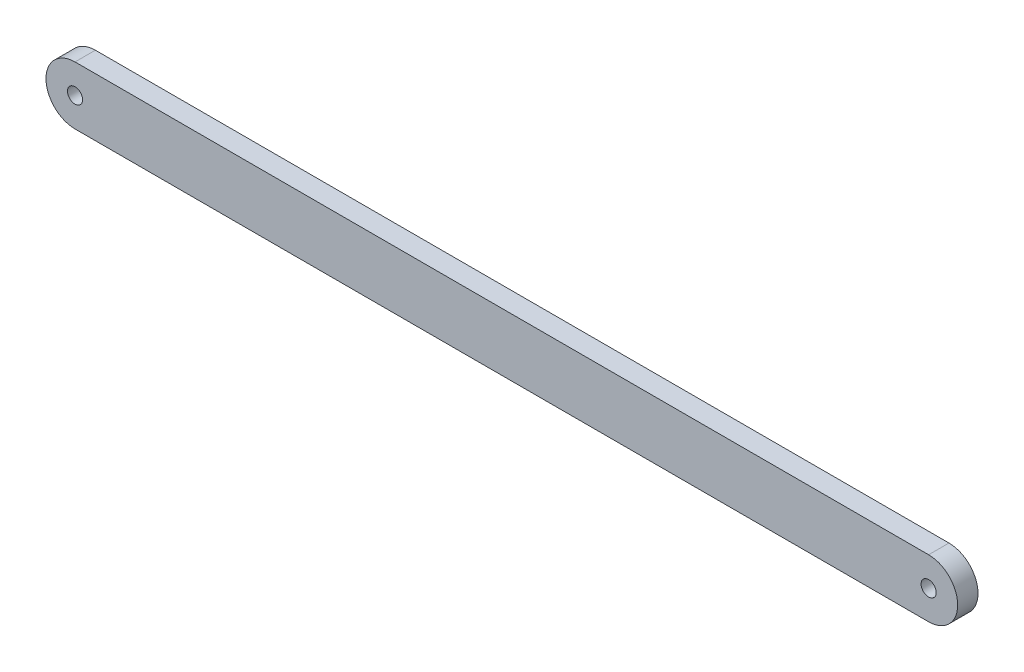
ISO-10303-21;
HEADER;
FILE_DESCRIPTION(('STEP AP214'),'2;1');
FILE_NAME('part.step','',(''),(''),'','','');
FILE_SCHEMA(('AUTOMOTIVE_DESIGN { 1 0 10303 214 1 1 1 1 }'));
ENDSEC;
DATA;
#1=APPLICATION_CONTEXT('core data for automotive mechanical design processes');
#2=APPLICATION_PROTOCOL_DEFINITION('international standard','automotive_design',2000,#1);
#3=PRODUCT_CONTEXT('',#1,'mechanical');
#4=PRODUCT('Part','Part','',(#3));
#5=PRODUCT_RELATED_PRODUCT_CATEGORY('part','',(#4));
#6=PRODUCT_DEFINITION_FORMATION('','',#4);
#7=PRODUCT_DEFINITION_CONTEXT('part definition',#1,'design');
#8=PRODUCT_DEFINITION('design','',#6,#7);
#9=PRODUCT_DEFINITION_SHAPE('','',#8);
#10=(LENGTH_UNIT() NAMED_UNIT(*) SI_UNIT(.MILLI.,.METRE.));
#11=(NAMED_UNIT(*) PLANE_ANGLE_UNIT() SI_UNIT($,.RADIAN.));
#12=(NAMED_UNIT(*) SI_UNIT($,.STERADIAN.) SOLID_ANGLE_UNIT());
#13=UNCERTAINTY_MEASURE_WITH_UNIT(LENGTH_MEASURE(1.E-05),#10,'distance_accuracy_value','');
#14=(GEOMETRIC_REPRESENTATION_CONTEXT(3) GLOBAL_UNCERTAINTY_ASSIGNED_CONTEXT((#13)) GLOBAL_UNIT_ASSIGNED_CONTEXT((#10,
#11,#12)) REPRESENTATION_CONTEXT('',''));
#15=CARTESIAN_POINT('',(0.,0.,0.));
#16=DIRECTION('',(0.,0.,1.));
#17=DIRECTION('',(1.,0.,0.));
#18=AXIS2_PLACEMENT_3D('',#15,#16,#17);
#19=CARTESIAN_POINT('',(0.,0.,7.));
#20=DIRECTION('',(0.,0.,1.));
#21=DIRECTION('',(1.,0.,0.));
#22=AXIS2_PLACEMENT_3D('',#19,#20,#21);
#23=PLANE('',#22);
#24=CARTESIAN_POINT('',(0.,0.,7.));
#25=DIRECTION('',(0.,0.,1.));
#26=DIRECTION('',(1.,0.,0.));
#27=AXIS2_PLACEMENT_3D('',#24,#25,#26);
#28=CIRCLE('',#27,2.6);
#29=CARTESIAN_POINT('',(2.6,0.,7.));
#30=VERTEX_POINT('',#29);
#31=EDGE_CURVE('E107',#30,#30,#28,.T.);
#32=ORIENTED_EDGE('',*,*,#31,.F.);
#33=EDGE_LOOP('',(#32));
#34=FACE_BOUND('',#33,.T.);
#35=CARTESIAN_POINT('',(0.,0.,7.));
#36=DIRECTION('',(0.,0.,1.));
#37=DIRECTION('',(1.,0.,0.));
#38=AXIS2_PLACEMENT_3D('',#35,#36,#37);
#39=CIRCLE('',#38,10.);
#40=CARTESIAN_POINT('',(0.,10.,7.));
#41=VERTEX_POINT('',#40);
#42=CARTESIAN_POINT('',(0.,-10.,7.));
#43=VERTEX_POINT('',#42);
#44=EDGE_CURVE('E92',#41,#43,#39,.T.);
#45=ORIENTED_EDGE('',*,*,#44,.T.);
#46=DIRECTION('',(1.,0.,0.));
#47=VECTOR('',#46,1.);
#48=CARTESIAN_POINT('',(0.,-10.,7.));
#49=LINE('',#48,#47);
#50=CARTESIAN_POINT('',(293.96,-10.,7.));
#51=VERTEX_POINT('',#50);
#52=EDGE_CURVE('E87',#43,#51,#49,.T.);
#53=ORIENTED_EDGE('',*,*,#52,.T.);
#54=CARTESIAN_POINT('',(293.96,0.,7.));
#55=DIRECTION('',(0.,0.,1.));
#56=DIRECTION('',(1.,0.,0.));
#57=AXIS2_PLACEMENT_3D('',#54,#55,#56);
#58=CIRCLE('',#57,10.);
#59=CARTESIAN_POINT('',(293.96,10.,7.));
#60=VERTEX_POINT('',#59);
#61=EDGE_CURVE('E90',#51,#60,#58,.T.);
#62=ORIENTED_EDGE('',*,*,#61,.T.);
#63=DIRECTION('',(-1.,0.,0.));
#64=VECTOR('',#63,1.);
#65=CARTESIAN_POINT('',(0.,10.,7.));
#66=LINE('',#65,#64);
#67=EDGE_CURVE('E57',#60,#41,#66,.T.);
#68=ORIENTED_EDGE('',*,*,#67,.T.);
#69=EDGE_LOOP('',(#45,#53,#62,#68));
#70=FACE_BOUND('',#69,.T.);
#71=CARTESIAN_POINT('',(293.96,0.,7.));
#72=DIRECTION('',(0.,0.,1.));
#73=DIRECTION('',(1.,0.,0.));
#74=AXIS2_PLACEMENT_3D('',#71,#72,#73);
#75=CIRCLE('',#74,2.60000000000002);
#76=CARTESIAN_POINT('',(296.56,0.,7.));
#77=VERTEX_POINT('',#76);
#78=EDGE_CURVE('E122',#77,#77,#75,.T.);
#79=ORIENTED_EDGE('',*,*,#78,.F.);
#80=EDGE_LOOP('',(#79));
#81=FACE_BOUND('',#80,.T.);
#82=ADVANCED_FACE('F40',(#34,#70,#81),#23,.T.);
#83=CARTESIAN_POINT('',(0.,0.,0.));
#84=DIRECTION('',(0.,0.,1.));
#85=DIRECTION('',(1.,0.,0.));
#86=AXIS2_PLACEMENT_3D('',#83,#84,#85);
#87=PLANE('',#86);
#88=CARTESIAN_POINT('',(0.,0.,0.));
#89=DIRECTION('',(0.,0.,1.));
#90=DIRECTION('',(1.,0.,0.));
#91=AXIS2_PLACEMENT_3D('',#88,#89,#90);
#92=CIRCLE('',#91,10.);
#93=CARTESIAN_POINT('',(0.,10.,0.));
#94=VERTEX_POINT('',#93);
#95=CARTESIAN_POINT('',(0.,-10.,0.));
#96=VERTEX_POINT('',#95);
#97=EDGE_CURVE('E104',#94,#96,#92,.T.);
#98=ORIENTED_EDGE('',*,*,#97,.F.);
#99=DIRECTION('',(-1.,0.,0.));
#100=VECTOR('',#99,1.);
#101=CARTESIAN_POINT('',(0.,10.,0.));
#102=LINE('',#101,#100);
#103=CARTESIAN_POINT('',(293.96,10.,0.));
#104=VERTEX_POINT('',#103);
#105=EDGE_CURVE('E80',#104,#94,#102,.T.);
#106=ORIENTED_EDGE('',*,*,#105,.F.);
#107=CARTESIAN_POINT('',(293.96,0.,0.));
#108=DIRECTION('',(0.,0.,1.));
#109=DIRECTION('',(1.,0.,0.));
#110=AXIS2_PLACEMENT_3D('',#107,#108,#109);
#111=CIRCLE('',#110,10.);
#112=CARTESIAN_POINT('',(293.96,-10.,0.));
#113=VERTEX_POINT('',#112);
#114=EDGE_CURVE('E74',#113,#104,#111,.T.);
#115=ORIENTED_EDGE('',*,*,#114,.F.);
#116=DIRECTION('',(1.,0.,0.));
#117=VECTOR('',#116,1.);
#118=CARTESIAN_POINT('',(0.,-10.,0.));
#119=LINE('',#118,#117);
#120=EDGE_CURVE('E96',#96,#113,#119,.T.);
#121=ORIENTED_EDGE('',*,*,#120,.F.);
#122=EDGE_LOOP('',(#98,#106,#115,#121));
#123=FACE_BOUND('',#122,.T.);
#124=CARTESIAN_POINT('',(0.,0.,0.));
#125=DIRECTION('',(0.,0.,1.));
#126=DIRECTION('',(1.,0.,0.));
#127=AXIS2_PLACEMENT_3D('',#124,#125,#126);
#128=CIRCLE('',#127,2.6);
#129=CARTESIAN_POINT('',(2.6,0.,0.));
#130=VERTEX_POINT('',#129);
#131=EDGE_CURVE('E119',#130,#130,#128,.T.);
#132=ORIENTED_EDGE('',*,*,#131,.T.);
#133=EDGE_LOOP('',(#132));
#134=FACE_BOUND('',#133,.T.);
#135=CARTESIAN_POINT('',(293.96,0.,0.));
#136=DIRECTION('',(0.,0.,1.));
#137=DIRECTION('',(1.,0.,0.));
#138=AXIS2_PLACEMENT_3D('',#135,#136,#137);
#139=CIRCLE('',#138,2.60000000000002);
#140=CARTESIAN_POINT('',(296.56,0.,0.));
#141=VERTEX_POINT('',#140);
#142=EDGE_CURVE('E125',#141,#141,#139,.T.);
#143=ORIENTED_EDGE('',*,*,#142,.T.);
#144=EDGE_LOOP('',(#143));
#145=FACE_BOUND('',#144,.T.);
#146=ADVANCED_FACE('F115',(#123,#134,#145),#87,.F.);
#147=CARTESIAN_POINT('',(0.,0.,7.));
#148=DIRECTION('',(0.,0.,-1.));
#149=DIRECTION('',(-1.,0.,0.));
#150=AXIS2_PLACEMENT_3D('',#147,#148,#149);
#151=CYLINDRICAL_SURFACE('',#150,10.);
#152=ORIENTED_EDGE('',*,*,#97,.T.);
#153=DIRECTION('',(0.,0.,-1.));
#154=VECTOR('',#153,1.);
#155=CARTESIAN_POINT('',(0.,-10.,7.));
#156=LINE('',#155,#154);
#157=EDGE_CURVE('E11',#43,#96,#156,.T.);
#158=ORIENTED_EDGE('',*,*,#157,.F.);
#159=ORIENTED_EDGE('',*,*,#44,.F.);
#160=DIRECTION('',(0.,0.,-1.));
#161=VECTOR('',#160,1.);
#162=CARTESIAN_POINT('',(0.,10.,7.));
#163=LINE('',#162,#161);
#164=EDGE_CURVE('E100',#41,#94,#163,.T.);
#165=ORIENTED_EDGE('',*,*,#164,.T.);
#166=EDGE_LOOP('',(#152,#158,#159,#165));
#167=FACE_BOUND('',#166,.T.);
#168=ADVANCED_FACE('F42',(#167),#151,.T.);
#169=CARTESIAN_POINT('',(0.,-10.,7.));
#170=DIRECTION('',(0.,1.,0.));
#171=DIRECTION('',(0.,0.,1.));
#172=AXIS2_PLACEMENT_3D('',#169,#170,#171);
#173=PLANE('',#172);
#174=ORIENTED_EDGE('',*,*,#120,.T.);
#175=DIRECTION('',(0.,0.,-1.));
#176=VECTOR('',#175,1.);
#177=CARTESIAN_POINT('',(293.96,-10.,7.));
#178=LINE('',#177,#176);
#179=EDGE_CURVE('E49',#51,#113,#178,.T.);
#180=ORIENTED_EDGE('',*,*,#179,.F.);
#181=ORIENTED_EDGE('',*,*,#52,.F.);
#182=ORIENTED_EDGE('',*,*,#157,.T.);
#183=EDGE_LOOP('',(#174,#180,#181,#182));
#184=FACE_BOUND('',#183,.T.);
#185=ADVANCED_FACE('F95',(#184),#173,.F.);
#186=CARTESIAN_POINT('',(293.96,0.,7.));
#187=DIRECTION('',(0.,0.,-1.));
#188=DIRECTION('',(-1.,0.,0.));
#189=AXIS2_PLACEMENT_3D('',#186,#187,#188);
#190=CYLINDRICAL_SURFACE('',#189,10.);
#191=ORIENTED_EDGE('',*,*,#114,.T.);
#192=DIRECTION('',(0.,0.,-1.));
#193=VECTOR('',#192,1.);
#194=CARTESIAN_POINT('',(293.96,10.,7.));
#195=LINE('',#194,#193);
#196=EDGE_CURVE('E97',#60,#104,#195,.T.);
#197=ORIENTED_EDGE('',*,*,#196,.F.);
#198=ORIENTED_EDGE('',*,*,#61,.F.);
#199=ORIENTED_EDGE('',*,*,#179,.T.);
#200=EDGE_LOOP('',(#191,#197,#198,#199));
#201=FACE_BOUND('',#200,.T.);
#202=ADVANCED_FACE('F98',(#201),#190,.T.);
#203=CARTESIAN_POINT('',(0.,10.,7.));
#204=DIRECTION('',(0.,-1.,0.));
#205=DIRECTION('',(0.,0.,-1.));
#206=AXIS2_PLACEMENT_3D('',#203,#204,#205);
#207=PLANE('',#206);
#208=ORIENTED_EDGE('',*,*,#105,.T.);
#209=ORIENTED_EDGE('',*,*,#164,.F.);
#210=ORIENTED_EDGE('',*,*,#67,.F.);
#211=ORIENTED_EDGE('',*,*,#196,.T.);
#212=EDGE_LOOP('',(#208,#209,#210,#211));
#213=FACE_BOUND('',#212,.T.);
#214=ADVANCED_FACE('F112',(#213),#207,.F.);
#215=CARTESIAN_POINT('',(0.,0.,7.));
#216=DIRECTION('',(0.,0.,-1.));
#217=DIRECTION('',(-1.,0.,0.));
#218=AXIS2_PLACEMENT_3D('',#215,#216,#217);
#219=CYLINDRICAL_SURFACE('',#218,2.6);
#220=ORIENTED_EDGE('',*,*,#31,.T.);
#221=EDGE_LOOP('',(#220));
#222=FACE_BOUND('',#221,.T.);
#223=ORIENTED_EDGE('',*,*,#131,.F.);
#224=EDGE_LOOP('',(#223));
#225=FACE_BOUND('',#224,.T.);
#226=ADVANCED_FACE('F142',(#222,#225),#219,.F.);
#227=CARTESIAN_POINT('',(293.96,0.,7.));
#228=DIRECTION('',(0.,0.,-1.));
#229=DIRECTION('',(-1.,0.,0.));
#230=AXIS2_PLACEMENT_3D('',#227,#228,#229);
#231=CYLINDRICAL_SURFACE('',#230,2.60000000000002);
#232=ORIENTED_EDGE('',*,*,#78,.T.);
#233=EDGE_LOOP('',(#232));
#234=FACE_BOUND('',#233,.T.);
#235=ORIENTED_EDGE('',*,*,#142,.F.);
#236=EDGE_LOOP('',(#235));
#237=FACE_BOUND('',#236,.T.);
#238=ADVANCED_FACE('F131',(#234,#237),#231,.F.);
#239=CLOSED_SHELL('',(#82,#146,#168,#185,#202,#214,#226,#238));
#240=MANIFOLD_SOLID_BREP('B2',#239);
#241=ADVANCED_BREP_SHAPE_REPRESENTATION('',(#18,#240),#14);
#242=SHAPE_DEFINITION_REPRESENTATION(#9,#241);
ENDSEC;
END-ISO-10303-21;
